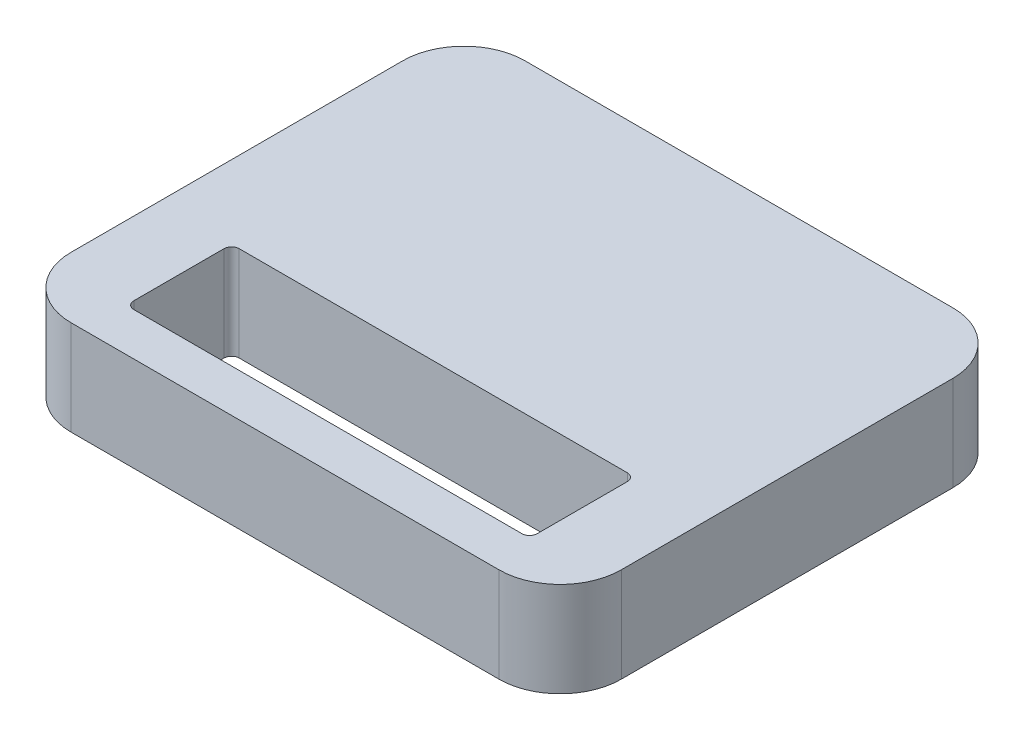
ISO-10303-21;
HEADER;
FILE_DESCRIPTION(('STEP AP214'),'2;1');
FILE_NAME('part.step','',(''),(''),'','','');
FILE_SCHEMA(('AUTOMOTIVE_DESIGN { 1 0 10303 214 1 1 1 1 }'));
ENDSEC;
DATA;
#1=APPLICATION_CONTEXT('core data for automotive mechanical design processes');
#2=APPLICATION_PROTOCOL_DEFINITION('international standard','automotive_design',2000,#1);
#3=PRODUCT_CONTEXT('',#1,'mechanical');
#4=PRODUCT('Part','Part','',(#3));
#5=PRODUCT_RELATED_PRODUCT_CATEGORY('part','',(#4));
#6=PRODUCT_DEFINITION_FORMATION('','',#4);
#7=PRODUCT_DEFINITION_CONTEXT('part definition',#1,'design');
#8=PRODUCT_DEFINITION('design','',#6,#7);
#9=PRODUCT_DEFINITION_SHAPE('','',#8);
#10=(LENGTH_UNIT() NAMED_UNIT(*) SI_UNIT(.MILLI.,.METRE.));
#11=(NAMED_UNIT(*) PLANE_ANGLE_UNIT() SI_UNIT($,.RADIAN.));
#12=(NAMED_UNIT(*) SI_UNIT($,.STERADIAN.) SOLID_ANGLE_UNIT());
#13=UNCERTAINTY_MEASURE_WITH_UNIT(LENGTH_MEASURE(1.E-05),#10,'distance_accuracy_value','');
#14=(GEOMETRIC_REPRESENTATION_CONTEXT(3) GLOBAL_UNCERTAINTY_ASSIGNED_CONTEXT((#13)) GLOBAL_UNIT_ASSIGNED_CONTEXT((#10,
#11,#12)) REPRESENTATION_CONTEXT('',''));
#15=CARTESIAN_POINT('',(0.,0.,0.));
#16=DIRECTION('',(0.,0.,1.));
#17=DIRECTION('',(1.,0.,0.));
#18=AXIS2_PLACEMENT_3D('',#15,#16,#17);
#19=CARTESIAN_POINT('',(0.,6.2,0.));
#20=DIRECTION('',(0.,1.,0.));
#21=DIRECTION('',(0.,0.,1.));
#22=AXIS2_PLACEMENT_3D('',#19,#20,#21);
#23=PLANE('',#22);
#24=DIRECTION('',(0.,0.,-1.));
#25=VECTOR('',#24,1.);
#26=CARTESIAN_POINT('',(18.,6.2,-23.45));
#27=LINE('',#26,#25);
#28=CARTESIAN_POINT('',(18.,6.2,2.25));
#29=VERTEX_POINT('',#28);
#30=CARTESIAN_POINT('',(18.,6.2,-19.45));
#31=VERTEX_POINT('',#30);
#32=EDGE_CURVE('E345',#29,#31,#27,.T.);
#33=ORIENTED_EDGE('',*,*,#32,.T.);
#34=CARTESIAN_POINT('',(14.,6.2,-19.45));
#35=DIRECTION('',(0.,1.,0.));
#36=DIRECTION('',(0.,0.,1.));
#37=AXIS2_PLACEMENT_3D('',#34,#35,#36);
#38=CIRCLE('',#37,4.);
#39=CARTESIAN_POINT('',(14.,6.2,-23.45));
#40=VERTEX_POINT('',#39);
#41=EDGE_CURVE('E237',#31,#40,#38,.T.);
#42=ORIENTED_EDGE('',*,*,#41,.T.);
#43=DIRECTION('',(-1.,0.,0.));
#44=VECTOR('',#43,1.);
#45=CARTESIAN_POINT('',(-18.,6.2,-23.45));
#46=LINE('',#45,#44);
#47=CARTESIAN_POINT('',(-14.,6.2,-23.45));
#48=VERTEX_POINT('',#47);
#49=EDGE_CURVE('E190',#40,#48,#46,.T.);
#50=ORIENTED_EDGE('',*,*,#49,.T.);
#51=CARTESIAN_POINT('',(-14.,6.2,-19.45));
#52=DIRECTION('',(0.,1.,0.));
#53=DIRECTION('',(0.,0.,1.));
#54=AXIS2_PLACEMENT_3D('',#51,#52,#53);
#55=CIRCLE('',#54,4.);
#56=CARTESIAN_POINT('',(-18.,6.2,-19.45));
#57=VERTEX_POINT('',#56);
#58=EDGE_CURVE('E228',#48,#57,#55,.T.);
#59=ORIENTED_EDGE('',*,*,#58,.T.);
#60=DIRECTION('',(0.,0.,1.));
#61=VECTOR('',#60,1.);
#62=CARTESIAN_POINT('',(-18.,6.2,-23.45));
#63=LINE('',#62,#61);
#64=CARTESIAN_POINT('',(-18.,6.2,2.25));
#65=VERTEX_POINT('',#64);
#66=EDGE_CURVE('E199',#57,#65,#63,.T.);
#67=ORIENTED_EDGE('',*,*,#66,.T.);
#68=CARTESIAN_POINT('',(-14.,6.2,2.25));
#69=DIRECTION('',(0.,1.,0.));
#70=DIRECTION('',(0.,0.,1.));
#71=AXIS2_PLACEMENT_3D('',#68,#69,#70);
#72=CIRCLE('',#71,4.);
#73=CARTESIAN_POINT('',(-14.,6.2,6.25));
#74=VERTEX_POINT('',#73);
#75=EDGE_CURVE('E231',#65,#74,#72,.T.);
#76=ORIENTED_EDGE('',*,*,#75,.T.);
#77=DIRECTION('',(1.,0.,0.));
#78=VECTOR('',#77,1.);
#79=CARTESIAN_POINT('',(-18.,6.2,6.25));
#80=LINE('',#79,#78);
#81=CARTESIAN_POINT('',(14.,6.2,6.25));
#82=VERTEX_POINT('',#81);
#83=EDGE_CURVE('E207',#74,#82,#80,.T.);
#84=ORIENTED_EDGE('',*,*,#83,.T.);
#85=CARTESIAN_POINT('',(14.,6.2,2.25));
#86=DIRECTION('',(0.,1.,0.));
#87=DIRECTION('',(0.,0.,1.));
#88=AXIS2_PLACEMENT_3D('',#85,#86,#87);
#89=CIRCLE('',#88,4.);
#90=EDGE_CURVE('E234',#82,#29,#89,.T.);
#91=ORIENTED_EDGE('',*,*,#90,.T.);
#92=EDGE_LOOP('',(#33,#42,#50,#59,#67,#76,#84,#91));
#93=FACE_BOUND('',#92,.T.);
#94=DIRECTION('',(-1.,0.,0.));
#95=VECTOR('',#94,1.);
#96=CARTESIAN_POINT('',(13.2,6.2,-3.45));
#97=LINE('',#96,#95);
#98=CARTESIAN_POINT('',(12.7,6.2,-3.45));
#99=VERTEX_POINT('',#98);
#100=CARTESIAN_POINT('',(-12.7,6.2,-3.45));
#101=VERTEX_POINT('',#100);
#102=EDGE_CURVE('E316',#99,#101,#97,.T.);
#103=ORIENTED_EDGE('',*,*,#102,.F.);
#104=CARTESIAN_POINT('',(12.7,6.2,-2.95));
#105=DIRECTION('',(0.,1.,0.));
#106=DIRECTION('',(0.,0.,1.));
#107=AXIS2_PLACEMENT_3D('',#104,#105,#106);
#108=CIRCLE('',#107,0.5);
#109=CARTESIAN_POINT('',(13.2,6.2,-2.95));
#110=VERTEX_POINT('',#109);
#111=EDGE_CURVE('E295',#99,#110,#108,.F.);
#112=ORIENTED_EDGE('',*,*,#111,.T.);
#113=DIRECTION('',(0.,0.,-1.));
#114=VECTOR('',#113,1.);
#115=CARTESIAN_POINT('',(13.2,6.2,3.45));
#116=LINE('',#115,#114);
#117=CARTESIAN_POINT('',(13.2,6.2,2.95));
#118=VERTEX_POINT('',#117);
#119=EDGE_CURVE('E320',#118,#110,#116,.T.);
#120=ORIENTED_EDGE('',*,*,#119,.F.);
#121=CARTESIAN_POINT('',(12.7,6.2,2.95));
#122=DIRECTION('',(0.,1.,0.));
#123=DIRECTION('',(0.,0.,1.));
#124=AXIS2_PLACEMENT_3D('',#121,#122,#123);
#125=CIRCLE('',#124,0.5);
#126=CARTESIAN_POINT('',(12.7,6.2,3.45));
#127=VERTEX_POINT('',#126);
#128=EDGE_CURVE('E289',#118,#127,#125,.F.);
#129=ORIENTED_EDGE('',*,*,#128,.T.);
#130=DIRECTION('',(1.,0.,0.));
#131=VECTOR('',#130,1.);
#132=CARTESIAN_POINT('',(13.2,6.2,3.45));
#133=LINE('',#132,#131);
#134=CARTESIAN_POINT('',(-12.7,6.2,3.45));
#135=VERTEX_POINT('',#134);
#136=EDGE_CURVE('E325',#135,#127,#133,.T.);
#137=ORIENTED_EDGE('',*,*,#136,.F.);
#138=CARTESIAN_POINT('',(-12.7,6.2,2.95));
#139=DIRECTION('',(0.,1.,0.));
#140=DIRECTION('',(0.,0.,1.));
#141=AXIS2_PLACEMENT_3D('',#138,#139,#140);
#142=CIRCLE('',#141,0.5);
#143=CARTESIAN_POINT('',(-13.2,6.2,2.95));
#144=VERTEX_POINT('',#143);
#145=EDGE_CURVE('E283',#135,#144,#142,.F.);
#146=ORIENTED_EDGE('',*,*,#145,.T.);
#147=DIRECTION('',(0.,0.,1.));
#148=VECTOR('',#147,1.);
#149=CARTESIAN_POINT('',(-13.2,6.2,3.45));
#150=LINE('',#149,#148);
#151=CARTESIAN_POINT('',(-13.2,6.2,-2.95));
#152=VERTEX_POINT('',#151);
#153=EDGE_CURVE('E319',#152,#144,#150,.T.);
#154=ORIENTED_EDGE('',*,*,#153,.F.);
#155=CARTESIAN_POINT('',(-12.7,6.2,-2.95));
#156=DIRECTION('',(0.,1.,0.));
#157=DIRECTION('',(0.,0.,1.));
#158=AXIS2_PLACEMENT_3D('',#155,#156,#157);
#159=CIRCLE('',#158,0.5);
#160=EDGE_CURVE('E11',#152,#101,#159,.F.);
#161=ORIENTED_EDGE('',*,*,#160,.T.);
#162=EDGE_LOOP('',(#103,#112,#120,#129,#137,#146,#154,#161));
#163=FACE_BOUND('',#162,.T.);
#164=ADVANCED_FACE('F55',(#93,#163),#23,.T.);
#165=CARTESIAN_POINT('',(0.,0.,0.));
#166=DIRECTION('',(0.,1.,0.));
#167=DIRECTION('',(0.,0.,1.));
#168=AXIS2_PLACEMENT_3D('',#165,#166,#167);
#169=PLANE('',#168);
#170=DIRECTION('',(-1.,0.,0.));
#171=VECTOR('',#170,1.);
#172=CARTESIAN_POINT('',(-18.,0.,-23.45));
#173=LINE('',#172,#171);
#174=CARTESIAN_POINT('',(14.,0.,-23.45));
#175=VERTEX_POINT('',#174);
#176=CARTESIAN_POINT('',(-14.,0.,-23.45));
#177=VERTEX_POINT('',#176);
#178=EDGE_CURVE('E187',#175,#177,#173,.T.);
#179=ORIENTED_EDGE('',*,*,#178,.F.);
#180=CARTESIAN_POINT('',(14.,0.,-19.45));
#181=DIRECTION('',(0.,1.,0.));
#182=DIRECTION('',(0.,0.,1.));
#183=AXIS2_PLACEMENT_3D('',#180,#181,#182);
#184=CIRCLE('',#183,4.);
#185=CARTESIAN_POINT('',(18.,0.,-19.45));
#186=VERTEX_POINT('',#185);
#187=EDGE_CURVE('E169',#175,#186,#184,.F.);
#188=ORIENTED_EDGE('',*,*,#187,.T.);
#189=DIRECTION('',(0.,0.,-1.));
#190=VECTOR('',#189,1.);
#191=CARTESIAN_POINT('',(18.,0.,-23.45));
#192=LINE('',#191,#190);
#193=CARTESIAN_POINT('',(18.,0.,2.25));
#194=VERTEX_POINT('',#193);
#195=EDGE_CURVE('E200',#194,#186,#192,.T.);
#196=ORIENTED_EDGE('',*,*,#195,.F.);
#197=CARTESIAN_POINT('',(14.,0.,2.25));
#198=DIRECTION('',(0.,1.,0.));
#199=DIRECTION('',(0.,0.,1.));
#200=AXIS2_PLACEMENT_3D('',#197,#198,#199);
#201=CIRCLE('',#200,4.);
#202=CARTESIAN_POINT('',(14.,0.,6.25));
#203=VERTEX_POINT('',#202);
#204=EDGE_CURVE('E181',#194,#203,#201,.F.);
#205=ORIENTED_EDGE('',*,*,#204,.T.);
#206=DIRECTION('',(1.,0.,0.));
#207=VECTOR('',#206,1.);
#208=CARTESIAN_POINT('',(-18.,0.,6.25));
#209=LINE('',#208,#207);
#210=CARTESIAN_POINT('',(-14.,0.,6.25));
#211=VERTEX_POINT('',#210);
#212=EDGE_CURVE('E210',#211,#203,#209,.T.);
#213=ORIENTED_EDGE('',*,*,#212,.F.);
#214=CARTESIAN_POINT('',(-14.,0.,2.25));
#215=DIRECTION('',(0.,1.,0.));
#216=DIRECTION('',(0.,0.,1.));
#217=AXIS2_PLACEMENT_3D('',#214,#215,#216);
#218=CIRCLE('',#217,4.);
#219=CARTESIAN_POINT('',(-18.,0.,2.25));
#220=VERTEX_POINT('',#219);
#221=EDGE_CURVE('E218',#211,#220,#218,.F.);
#222=ORIENTED_EDGE('',*,*,#221,.T.);
#223=DIRECTION('',(0.,0.,1.));
#224=VECTOR('',#223,1.);
#225=CARTESIAN_POINT('',(-18.,0.,-23.45));
#226=LINE('',#225,#224);
#227=CARTESIAN_POINT('',(-18.,0.,-19.45));
#228=VERTEX_POINT('',#227);
#229=EDGE_CURVE('E333',#228,#220,#226,.T.);
#230=ORIENTED_EDGE('',*,*,#229,.F.);
#231=CARTESIAN_POINT('',(-14.,0.,-19.45));
#232=DIRECTION('',(0.,1.,0.));
#233=DIRECTION('',(0.,0.,1.));
#234=AXIS2_PLACEMENT_3D('',#231,#232,#233);
#235=CIRCLE('',#234,4.);
#236=EDGE_CURVE('E192',#228,#177,#235,.F.);
#237=ORIENTED_EDGE('',*,*,#236,.T.);
#238=EDGE_LOOP('',(#179,#188,#196,#205,#213,#222,#230,#237));
#239=FACE_BOUND('',#238,.T.);
#240=DIRECTION('',(1.,0.,0.));
#241=VECTOR('',#240,1.);
#242=CARTESIAN_POINT('',(13.2,0.,3.45));
#243=LINE('',#242,#241);
#244=CARTESIAN_POINT('',(-12.7,0.,3.45));
#245=VERTEX_POINT('',#244);
#246=CARTESIAN_POINT('',(12.7,0.,3.45));
#247=VERTEX_POINT('',#246);
#248=EDGE_CURVE('E313',#245,#247,#243,.T.);
#249=ORIENTED_EDGE('',*,*,#248,.T.);
#250=CARTESIAN_POINT('',(12.7,0.,2.95));
#251=DIRECTION('',(0.,1.,0.));
#252=DIRECTION('',(0.,0.,1.));
#253=AXIS2_PLACEMENT_3D('',#250,#251,#252);
#254=CIRCLE('',#253,0.5);
#255=CARTESIAN_POINT('',(13.2,0.,2.95));
#256=VERTEX_POINT('',#255);
#257=EDGE_CURVE('E286',#247,#256,#254,.T.);
#258=ORIENTED_EDGE('',*,*,#257,.T.);
#259=DIRECTION('',(0.,0.,-1.));
#260=VECTOR('',#259,1.);
#261=CARTESIAN_POINT('',(13.2,0.,3.45));
#262=LINE('',#261,#260);
#263=CARTESIAN_POINT('',(13.2,0.,-2.95));
#264=VERTEX_POINT('',#263);
#265=EDGE_CURVE('E334',#256,#264,#262,.T.);
#266=ORIENTED_EDGE('',*,*,#265,.T.);
#267=CARTESIAN_POINT('',(12.7,0.,-2.95));
#268=DIRECTION('',(0.,1.,0.));
#269=DIRECTION('',(0.,0.,1.));
#270=AXIS2_PLACEMENT_3D('',#267,#268,#269);
#271=CIRCLE('',#270,0.5);
#272=CARTESIAN_POINT('',(12.7,0.,-3.45));
#273=VERTEX_POINT('',#272);
#274=EDGE_CURVE('E292',#264,#273,#271,.T.);
#275=ORIENTED_EDGE('',*,*,#274,.T.);
#276=DIRECTION('',(-1.,0.,0.));
#277=VECTOR('',#276,1.);
#278=CARTESIAN_POINT('',(13.2,0.,-3.45));
#279=LINE('',#278,#277);
#280=CARTESIAN_POINT('',(-12.7,0.,-3.45));
#281=VERTEX_POINT('',#280);
#282=EDGE_CURVE('E305',#273,#281,#279,.T.);
#283=ORIENTED_EDGE('',*,*,#282,.T.);
#284=CARTESIAN_POINT('',(-12.7,0.,-2.95));
#285=DIRECTION('',(0.,1.,0.));
#286=DIRECTION('',(0.,0.,1.));
#287=AXIS2_PLACEMENT_3D('',#284,#285,#286);
#288=CIRCLE('',#287,0.5);
#289=CARTESIAN_POINT('',(-13.2,0.,-2.95));
#290=VERTEX_POINT('',#289);
#291=EDGE_CURVE('E64',#281,#290,#288,.T.);
#292=ORIENTED_EDGE('',*,*,#291,.T.);
#293=DIRECTION('',(0.,0.,1.));
#294=VECTOR('',#293,1.);
#295=CARTESIAN_POINT('',(-13.2,0.,3.45));
#296=LINE('',#295,#294);
#297=CARTESIAN_POINT('',(-13.2,0.,2.95));
#298=VERTEX_POINT('',#297);
#299=EDGE_CURVE('E304',#290,#298,#296,.T.);
#300=ORIENTED_EDGE('',*,*,#299,.T.);
#301=CARTESIAN_POINT('',(-12.7,0.,2.95));
#302=DIRECTION('',(0.,1.,0.));
#303=DIRECTION('',(0.,0.,1.));
#304=AXIS2_PLACEMENT_3D('',#301,#302,#303);
#305=CIRCLE('',#304,0.5);
#306=EDGE_CURVE('E280',#298,#245,#305,.T.);
#307=ORIENTED_EDGE('',*,*,#306,.T.);
#308=EDGE_LOOP('',(#249,#258,#266,#275,#283,#292,#300,#307));
#309=FACE_BOUND('',#308,.T.);
#310=ADVANCED_FACE('F195',(#239,#309),#169,.F.);
#311=CARTESIAN_POINT('',(-18.,6.2,-23.45));
#312=DIRECTION('',(1.,0.,0.));
#313=DIRECTION('',(0.,0.,-1.));
#314=AXIS2_PLACEMENT_3D('',#311,#312,#313);
#315=PLANE('',#314);
#316=ORIENTED_EDGE('',*,*,#229,.T.);
#317=DIRECTION('',(0.,-1.,0.));
#318=VECTOR('',#317,1.);
#319=CARTESIAN_POINT('',(-18.,6.2,2.25));
#320=LINE('',#319,#318);
#321=EDGE_CURVE('E251',#220,#65,#320,.F.);
#322=ORIENTED_EDGE('',*,*,#321,.T.);
#323=ORIENTED_EDGE('',*,*,#66,.F.);
#324=DIRECTION('',(0.,-1.,0.));
#325=VECTOR('',#324,1.);
#326=CARTESIAN_POINT('',(-18.,6.2,-19.45));
#327=LINE('',#326,#325);
#328=EDGE_CURVE('E247',#57,#228,#327,.T.);
#329=ORIENTED_EDGE('',*,*,#328,.T.);
#330=EDGE_LOOP('',(#316,#322,#323,#329));
#331=FACE_BOUND('',#330,.T.);
#332=ADVANCED_FACE('F376',(#331),#315,.F.);
#333=CARTESIAN_POINT('',(-18.,6.2,6.25));
#334=DIRECTION('',(0.,0.,-1.));
#335=DIRECTION('',(-1.,0.,0.));
#336=AXIS2_PLACEMENT_3D('',#333,#334,#335);
#337=PLANE('',#336);
#338=ORIENTED_EDGE('',*,*,#212,.T.);
#339=DIRECTION('',(0.,-1.,0.));
#340=VECTOR('',#339,1.);
#341=CARTESIAN_POINT('',(14.,6.2,6.25));
#342=LINE('',#341,#340);
#343=EDGE_CURVE('E244',#203,#82,#342,.F.);
#344=ORIENTED_EDGE('',*,*,#343,.T.);
#345=ORIENTED_EDGE('',*,*,#83,.F.);
#346=DIRECTION('',(0.,-1.,0.));
#347=VECTOR('',#346,1.);
#348=CARTESIAN_POINT('',(-14.,6.2,6.25));
#349=LINE('',#348,#347);
#350=EDGE_CURVE('E240',#74,#211,#349,.T.);
#351=ORIENTED_EDGE('',*,*,#350,.T.);
#352=EDGE_LOOP('',(#338,#344,#345,#351));
#353=FACE_BOUND('',#352,.T.);
#354=ADVANCED_FACE('F358',(#353),#337,.F.);
#355=CARTESIAN_POINT('',(18.,6.2,-23.45));
#356=DIRECTION('',(-1.,0.,0.));
#357=DIRECTION('',(0.,0.,1.));
#358=AXIS2_PLACEMENT_3D('',#355,#356,#357);
#359=PLANE('',#358);
#360=ORIENTED_EDGE('',*,*,#195,.T.);
#361=DIRECTION('',(0.,-1.,0.));
#362=VECTOR('',#361,1.);
#363=CARTESIAN_POINT('',(18.,6.2,-19.45));
#364=LINE('',#363,#362);
#365=EDGE_CURVE('E174',#186,#31,#364,.F.);
#366=ORIENTED_EDGE('',*,*,#365,.T.);
#367=ORIENTED_EDGE('',*,*,#32,.F.);
#368=DIRECTION('',(0.,-1.,0.));
#369=VECTOR('',#368,1.);
#370=CARTESIAN_POINT('',(18.,6.2,2.25));
#371=LINE('',#370,#369);
#372=EDGE_CURVE('E180',#29,#194,#371,.T.);
#373=ORIENTED_EDGE('',*,*,#372,.T.);
#374=EDGE_LOOP('',(#360,#366,#367,#373));
#375=FACE_BOUND('',#374,.T.);
#376=ADVANCED_FACE('F368',(#375),#359,.F.);
#377=CARTESIAN_POINT('',(-18.,6.2,-23.45));
#378=DIRECTION('',(0.,0.,1.));
#379=DIRECTION('',(1.,0.,0.));
#380=AXIS2_PLACEMENT_3D('',#377,#378,#379);
#381=PLANE('',#380);
#382=ORIENTED_EDGE('',*,*,#49,.F.);
#383=DIRECTION('',(0.,-1.,0.));
#384=VECTOR('',#383,1.);
#385=CARTESIAN_POINT('',(14.,6.2,-23.45));
#386=LINE('',#385,#384);
#387=EDGE_CURVE('E173',#40,#175,#386,.T.);
#388=ORIENTED_EDGE('',*,*,#387,.T.);
#389=ORIENTED_EDGE('',*,*,#178,.T.);
#390=DIRECTION('',(0.,-1.,0.));
#391=VECTOR('',#390,1.);
#392=CARTESIAN_POINT('',(-14.,6.2,-23.45));
#393=LINE('',#392,#391);
#394=EDGE_CURVE('E193',#177,#48,#393,.F.);
#395=ORIENTED_EDGE('',*,*,#394,.T.);
#396=EDGE_LOOP('',(#382,#388,#389,#395));
#397=FACE_BOUND('',#396,.T.);
#398=ADVANCED_FACE('F186',(#397),#381,.F.);
#399=CARTESIAN_POINT('',(13.2,6.2,3.45));
#400=DIRECTION('',(-1.,0.,0.));
#401=DIRECTION('',(0.,0.,1.));
#402=AXIS2_PLACEMENT_3D('',#399,#400,#401);
#403=PLANE('',#402);
#404=ORIENTED_EDGE('',*,*,#265,.F.);
#405=DIRECTION('',(0.,-1.,0.));
#406=VECTOR('',#405,1.);
#407=CARTESIAN_POINT('',(13.2,6.2,2.95));
#408=LINE('',#407,#406);
#409=EDGE_CURVE('E271',#256,#118,#408,.F.);
#410=ORIENTED_EDGE('',*,*,#409,.T.);
#411=ORIENTED_EDGE('',*,*,#119,.T.);
#412=DIRECTION('',(0.,-1.,0.));
#413=VECTOR('',#412,1.);
#414=CARTESIAN_POINT('',(13.2,0.,-2.95));
#415=LINE('',#414,#413);
#416=EDGE_CURVE('E267',#110,#264,#415,.T.);
#417=ORIENTED_EDGE('',*,*,#416,.T.);
#418=EDGE_LOOP('',(#404,#410,#411,#417));
#419=FACE_BOUND('',#418,.T.);
#420=ADVANCED_FACE('F374',(#419),#403,.T.);
#421=CARTESIAN_POINT('',(13.2,6.2,-3.45));
#422=DIRECTION('',(0.,0.,1.));
#423=DIRECTION('',(1.,0.,0.));
#424=AXIS2_PLACEMENT_3D('',#421,#422,#423);
#425=PLANE('',#424);
#426=ORIENTED_EDGE('',*,*,#282,.F.);
#427=DIRECTION('',(0.,-1.,0.));
#428=VECTOR('',#427,1.);
#429=CARTESIAN_POINT('',(12.7,6.2,-3.45));
#430=LINE('',#429,#428);
#431=EDGE_CURVE('E76',#273,#99,#430,.F.);
#432=ORIENTED_EDGE('',*,*,#431,.T.);
#433=ORIENTED_EDGE('',*,*,#102,.T.);
#434=DIRECTION('',(0.,-1.,0.));
#435=VECTOR('',#434,1.);
#436=CARTESIAN_POINT('',(-12.7,0.,-3.45));
#437=LINE('',#436,#435);
#438=EDGE_CURVE('E274',#101,#281,#437,.T.);
#439=ORIENTED_EDGE('',*,*,#438,.T.);
#440=EDGE_LOOP('',(#426,#432,#433,#439));
#441=FACE_BOUND('',#440,.T.);
#442=ADVANCED_FACE('F315',(#441),#425,.T.);
#443=CARTESIAN_POINT('',(-13.2,6.2,3.45));
#444=DIRECTION('',(1.,0.,0.));
#445=DIRECTION('',(0.,0.,-1.));
#446=AXIS2_PLACEMENT_3D('',#443,#444,#445);
#447=PLANE('',#446);
#448=ORIENTED_EDGE('',*,*,#153,.T.);
#449=DIRECTION('',(0.,-1.,0.));
#450=VECTOR('',#449,1.);
#451=CARTESIAN_POINT('',(-13.2,0.,2.95));
#452=LINE('',#451,#450);
#453=EDGE_CURVE('E257',#144,#298,#452,.T.);
#454=ORIENTED_EDGE('',*,*,#453,.T.);
#455=ORIENTED_EDGE('',*,*,#299,.F.);
#456=DIRECTION('',(0.,-1.,0.));
#457=VECTOR('',#456,1.);
#458=CARTESIAN_POINT('',(-13.2,6.2,-2.95));
#459=LINE('',#458,#457);
#460=EDGE_CURVE('E254',#290,#152,#459,.F.);
#461=ORIENTED_EDGE('',*,*,#460,.T.);
#462=EDGE_LOOP('',(#448,#454,#455,#461));
#463=FACE_BOUND('',#462,.T.);
#464=ADVANCED_FACE('F311',(#463),#447,.T.);
#465=CARTESIAN_POINT('',(13.2,6.2,3.45));
#466=DIRECTION('',(0.,0.,-1.));
#467=DIRECTION('',(-1.,0.,0.));
#468=AXIS2_PLACEMENT_3D('',#465,#466,#467);
#469=PLANE('',#468);
#470=ORIENTED_EDGE('',*,*,#248,.F.);
#471=DIRECTION('',(0.,-1.,0.));
#472=VECTOR('',#471,1.);
#473=CARTESIAN_POINT('',(-12.7,6.2,3.45));
#474=LINE('',#473,#472);
#475=EDGE_CURVE('E264',#245,#135,#474,.F.);
#476=ORIENTED_EDGE('',*,*,#475,.T.);
#477=ORIENTED_EDGE('',*,*,#136,.T.);
#478=DIRECTION('',(0.,-1.,0.));
#479=VECTOR('',#478,1.);
#480=CARTESIAN_POINT('',(12.7,0.,3.45));
#481=LINE('',#480,#479);
#482=EDGE_CURVE('E260',#127,#247,#481,.T.);
#483=ORIENTED_EDGE('',*,*,#482,.T.);
#484=EDGE_LOOP('',(#470,#476,#477,#483));
#485=FACE_BOUND('',#484,.T.);
#486=ADVANCED_FACE('F391',(#485),#469,.T.);
#487=CARTESIAN_POINT('',(14.,6.2,-19.45));
#488=DIRECTION('',(0.,-1.,0.));
#489=DIRECTION('',(0.,0.,-1.));
#490=AXIS2_PLACEMENT_3D('',#487,#488,#489);
#491=CYLINDRICAL_SURFACE('',#490,4.);
#492=ORIENTED_EDGE('',*,*,#41,.F.);
#493=ORIENTED_EDGE('',*,*,#365,.F.);
#494=ORIENTED_EDGE('',*,*,#187,.F.);
#495=ORIENTED_EDGE('',*,*,#387,.F.);
#496=EDGE_LOOP('',(#492,#493,#494,#495));
#497=FACE_BOUND('',#496,.T.);
#498=ADVANCED_FACE('F172',(#497),#491,.T.);
#499=CARTESIAN_POINT('',(14.,6.2,2.25));
#500=DIRECTION('',(0.,-1.,0.));
#501=DIRECTION('',(0.,0.,-1.));
#502=AXIS2_PLACEMENT_3D('',#499,#500,#501);
#503=CYLINDRICAL_SURFACE('',#502,4.);
#504=ORIENTED_EDGE('',*,*,#90,.F.);
#505=ORIENTED_EDGE('',*,*,#343,.F.);
#506=ORIENTED_EDGE('',*,*,#204,.F.);
#507=ORIENTED_EDGE('',*,*,#372,.F.);
#508=EDGE_LOOP('',(#504,#505,#506,#507));
#509=FACE_BOUND('',#508,.T.);
#510=ADVANCED_FACE('F363',(#509),#503,.T.);
#511=CARTESIAN_POINT('',(-14.,6.2,2.25));
#512=DIRECTION('',(0.,-1.,0.));
#513=DIRECTION('',(0.,0.,-1.));
#514=AXIS2_PLACEMENT_3D('',#511,#512,#513);
#515=CYLINDRICAL_SURFACE('',#514,4.);
#516=ORIENTED_EDGE('',*,*,#75,.F.);
#517=ORIENTED_EDGE('',*,*,#321,.F.);
#518=ORIENTED_EDGE('',*,*,#221,.F.);
#519=ORIENTED_EDGE('',*,*,#350,.F.);
#520=EDGE_LOOP('',(#516,#517,#518,#519));
#521=FACE_BOUND('',#520,.T.);
#522=ADVANCED_FACE('F425',(#521),#515,.T.);
#523=CARTESIAN_POINT('',(-14.,6.2,-19.45));
#524=DIRECTION('',(0.,-1.,0.));
#525=DIRECTION('',(0.,0.,-1.));
#526=AXIS2_PLACEMENT_3D('',#523,#524,#525);
#527=CYLINDRICAL_SURFACE('',#526,4.);
#528=ORIENTED_EDGE('',*,*,#58,.F.);
#529=ORIENTED_EDGE('',*,*,#394,.F.);
#530=ORIENTED_EDGE('',*,*,#236,.F.);
#531=ORIENTED_EDGE('',*,*,#328,.F.);
#532=EDGE_LOOP('',(#528,#529,#530,#531));
#533=FACE_BOUND('',#532,.T.);
#534=ADVANCED_FACE('F422',(#533),#527,.T.);
#535=CARTESIAN_POINT('',(-12.7,6.2,2.95));
#536=DIRECTION('',(0.,1.,0.));
#537=DIRECTION('',(0.,0.,1.));
#538=AXIS2_PLACEMENT_3D('',#535,#536,#537);
#539=CYLINDRICAL_SURFACE('',#538,0.5);
#540=ORIENTED_EDGE('',*,*,#145,.F.);
#541=ORIENTED_EDGE('',*,*,#475,.F.);
#542=ORIENTED_EDGE('',*,*,#306,.F.);
#543=ORIENTED_EDGE('',*,*,#453,.F.);
#544=EDGE_LOOP('',(#540,#541,#542,#543));
#545=FACE_BOUND('',#544,.T.);
#546=ADVANCED_FACE('F403',(#545),#539,.F.);
#547=CARTESIAN_POINT('',(12.7,6.2,2.95));
#548=DIRECTION('',(0.,1.,0.));
#549=DIRECTION('',(0.,0.,1.));
#550=AXIS2_PLACEMENT_3D('',#547,#548,#549);
#551=CYLINDRICAL_SURFACE('',#550,0.5);
#552=ORIENTED_EDGE('',*,*,#128,.F.);
#553=ORIENTED_EDGE('',*,*,#409,.F.);
#554=ORIENTED_EDGE('',*,*,#257,.F.);
#555=ORIENTED_EDGE('',*,*,#482,.F.);
#556=EDGE_LOOP('',(#552,#553,#554,#555));
#557=FACE_BOUND('',#556,.T.);
#558=ADVANCED_FACE('F407',(#557),#551,.F.);
#559=CARTESIAN_POINT('',(12.7,6.2,-2.95));
#560=DIRECTION('',(0.,1.,0.));
#561=DIRECTION('',(0.,0.,1.));
#562=AXIS2_PLACEMENT_3D('',#559,#560,#561);
#563=CYLINDRICAL_SURFACE('',#562,0.5);
#564=ORIENTED_EDGE('',*,*,#111,.F.);
#565=ORIENTED_EDGE('',*,*,#431,.F.);
#566=ORIENTED_EDGE('',*,*,#274,.F.);
#567=ORIENTED_EDGE('',*,*,#416,.F.);
#568=EDGE_LOOP('',(#564,#565,#566,#567));
#569=FACE_BOUND('',#568,.T.);
#570=ADVANCED_FACE('F412',(#569),#563,.F.);
#571=CARTESIAN_POINT('',(-12.7,6.2,-2.95));
#572=DIRECTION('',(0.,1.,0.));
#573=DIRECTION('',(0.,0.,1.));
#574=AXIS2_PLACEMENT_3D('',#571,#572,#573);
#575=CYLINDRICAL_SURFACE('',#574,0.5);
#576=ORIENTED_EDGE('',*,*,#160,.F.);
#577=ORIENTED_EDGE('',*,*,#460,.F.);
#578=ORIENTED_EDGE('',*,*,#291,.F.);
#579=ORIENTED_EDGE('',*,*,#438,.F.);
#580=EDGE_LOOP('',(#576,#577,#578,#579));
#581=FACE_BOUND('',#580,.T.);
#582=ADVANCED_FACE('F57',(#581),#575,.F.);
#583=CLOSED_SHELL('',(#164,#310,#332,#354,#376,#398,#420,#442,#464,#486,#498,#510,#522,#534,
#546,#558,#570,#582));
#584=MANIFOLD_SOLID_BREP('B2',#583);
#585=ADVANCED_BREP_SHAPE_REPRESENTATION('',(#18,#584),#14);
#586=SHAPE_DEFINITION_REPRESENTATION(#9,#585);
ENDSEC;
END-ISO-10303-21;
